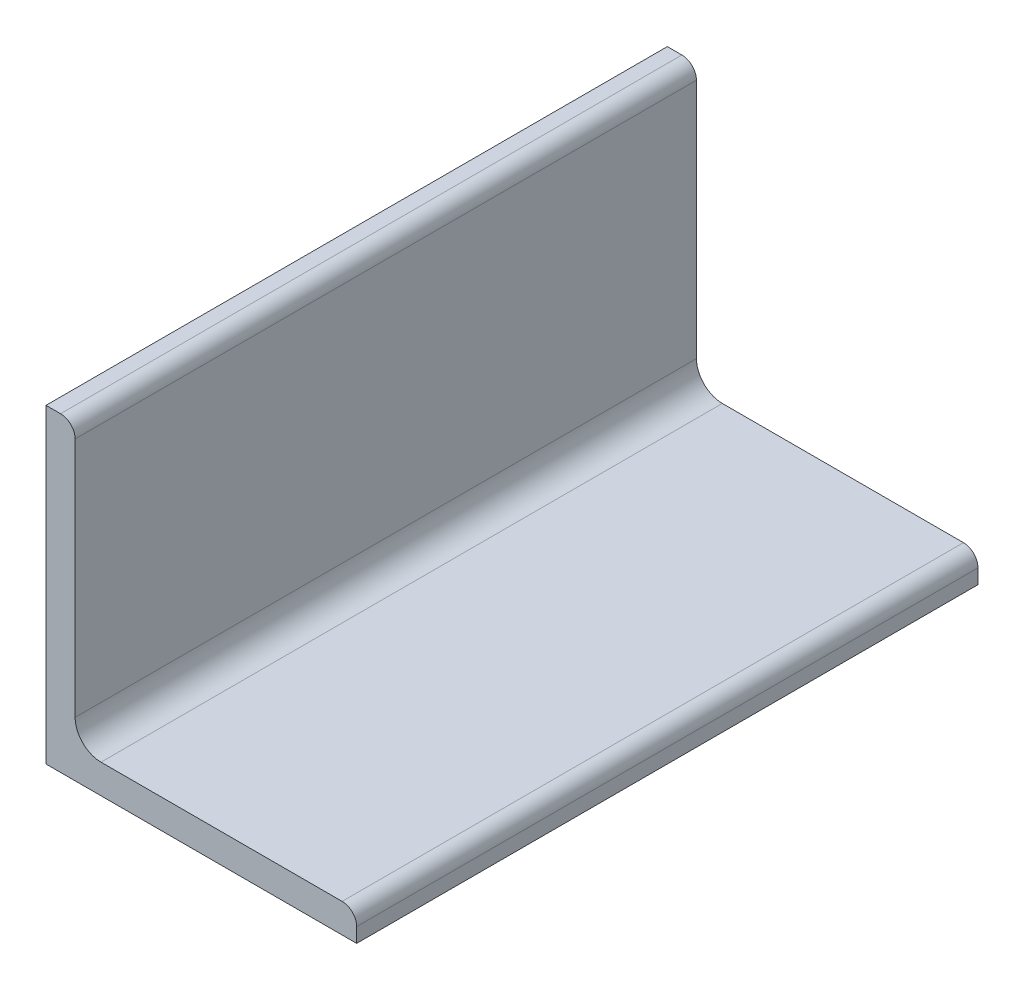
ISO-10303-21;
HEADER;
FILE_DESCRIPTION(('STEP AP214'),'2;1');
FILE_NAME('part.step','',(''),(''),'','','');
FILE_SCHEMA(('AUTOMOTIVE_DESIGN { 1 0 10303 214 1 1 1 1 }'));
ENDSEC;
DATA;
#1=APPLICATION_CONTEXT('core data for automotive mechanical design processes');
#2=APPLICATION_PROTOCOL_DEFINITION('international standard','automotive_design',2000,#1);
#3=PRODUCT_CONTEXT('',#1,'mechanical');
#4=PRODUCT('Part','Part','',(#3));
#5=PRODUCT_RELATED_PRODUCT_CATEGORY('part','',(#4));
#6=PRODUCT_DEFINITION_FORMATION('','',#4);
#7=PRODUCT_DEFINITION_CONTEXT('part definition',#1,'design');
#8=PRODUCT_DEFINITION('design','',#6,#7);
#9=PRODUCT_DEFINITION_SHAPE('','',#8);
#10=(LENGTH_UNIT() NAMED_UNIT(*) SI_UNIT(.MILLI.,.METRE.));
#11=(NAMED_UNIT(*) PLANE_ANGLE_UNIT() SI_UNIT($,.RADIAN.));
#12=(NAMED_UNIT(*) SI_UNIT($,.STERADIAN.) SOLID_ANGLE_UNIT());
#13=UNCERTAINTY_MEASURE_WITH_UNIT(LENGTH_MEASURE(1.E-05),#10,'distance_accuracy_value','');
#14=(GEOMETRIC_REPRESENTATION_CONTEXT(3) GLOBAL_UNCERTAINTY_ASSIGNED_CONTEXT((#13)) GLOBAL_UNIT_ASSIGNED_CONTEXT((#10,
#11,#12)) REPRESENTATION_CONTEXT('',''));
#15=CARTESIAN_POINT('',(0.,0.,0.));
#16=DIRECTION('',(0.,0.,1.));
#17=DIRECTION('',(1.,0.,0.));
#18=AXIS2_PLACEMENT_3D('',#15,#16,#17);
#19=CARTESIAN_POINT('',(0.425014111727251,152.925428131371,304.8));
#20=DIRECTION('',(1.,0.,0.));
#21=DIRECTION('',(0.,0.,-1.));
#22=AXIS2_PLACEMENT_3D('',#19,#20,#21);
#23=PLANE('',#22);
#24=DIRECTION('',(0.,-1.,0.));
#25=VECTOR('',#24,1.);
#26=CARTESIAN_POINT('',(0.425014111727251,152.925428131371,0.));
#27=LINE('',#26,#25);
#28=CARTESIAN_POINT('',(0.425014111727251,152.925428131371,0.));
#29=VERTEX_POINT('',#28);
#30=CARTESIAN_POINT('',(0.425014111727251,0.525428131371291,0.));
#31=VERTEX_POINT('',#30);
#32=EDGE_CURVE('E135',#29,#31,#27,.T.);
#33=ORIENTED_EDGE('',*,*,#32,.T.);
#34=DIRECTION('',(0.,0.,-1.));
#35=VECTOR('',#34,1.);
#36=CARTESIAN_POINT('',(0.425014111727251,0.525428131371291,304.8));
#37=LINE('',#36,#35);
#38=CARTESIAN_POINT('',(0.425014111727251,0.525428131371291,304.8));
#39=VERTEX_POINT('',#38);
#40=EDGE_CURVE('E11',#39,#31,#37,.T.);
#41=ORIENTED_EDGE('',*,*,#40,.F.);
#42=DIRECTION('',(0.,-1.,0.));
#43=VECTOR('',#42,1.);
#44=CARTESIAN_POINT('',(0.425014111727251,152.925428131371,304.8));
#45=LINE('',#44,#43);
#46=CARTESIAN_POINT('',(0.425014111727251,152.925428131371,304.8));
#47=VERTEX_POINT('',#46);
#48=EDGE_CURVE('E151',#47,#39,#45,.T.);
#49=ORIENTED_EDGE('',*,*,#48,.F.);
#50=DIRECTION('',(0.,0.,-1.));
#51=VECTOR('',#50,1.);
#52=CARTESIAN_POINT('',(0.425014111727251,152.925428131371,304.8));
#53=LINE('',#52,#51);
#54=EDGE_CURVE('E131',#47,#29,#53,.T.);
#55=ORIENTED_EDGE('',*,*,#54,.T.);
#56=EDGE_LOOP('',(#33,#41,#49,#55));
#57=FACE_BOUND('',#56,.T.);
#58=ADVANCED_FACE('F33',(#57),#23,.F.);
#59=CARTESIAN_POINT('',(0.425014111727251,0.525428131371291,304.8));
#60=DIRECTION('',(0.,1.,0.));
#61=DIRECTION('',(0.,0.,1.));
#62=AXIS2_PLACEMENT_3D('',#59,#60,#61);
#63=PLANE('',#62);
#64=DIRECTION('',(1.,0.,0.));
#65=VECTOR('',#64,1.);
#66=CARTESIAN_POINT('',(0.425014111727251,0.525428131371291,0.));
#67=LINE('',#66,#65);
#68=CARTESIAN_POINT('',(152.825014111727,0.525428131371291,0.));
#69=VERTEX_POINT('',#68);
#70=EDGE_CURVE('E138',#31,#69,#67,.T.);
#71=ORIENTED_EDGE('',*,*,#70,.T.);
#72=DIRECTION('',(0.,0.,-1.));
#73=VECTOR('',#72,1.);
#74=CARTESIAN_POINT('',(152.825014111727,0.525428131371291,304.8));
#75=LINE('',#74,#73);
#76=CARTESIAN_POINT('',(152.825014111727,0.525428131371291,304.8));
#77=VERTEX_POINT('',#76);
#78=EDGE_CURVE('E41',#77,#69,#75,.T.);
#79=ORIENTED_EDGE('',*,*,#78,.F.);
#80=DIRECTION('',(1.,0.,0.));
#81=VECTOR('',#80,1.);
#82=CARTESIAN_POINT('',(0.425014111727251,0.525428131371291,304.8));
#83=LINE('',#82,#81);
#84=EDGE_CURVE('E95',#39,#77,#83,.T.);
#85=ORIENTED_EDGE('',*,*,#84,.F.);
#86=ORIENTED_EDGE('',*,*,#40,.T.);
#87=EDGE_LOOP('',(#71,#79,#85,#86));
#88=FACE_BOUND('',#87,.T.);
#89=ADVANCED_FACE('F194',(#88),#63,.F.);
#90=CARTESIAN_POINT('',(152.825014111727,0.525428131371291,304.8));
#91=DIRECTION('',(-1.,0.,0.));
#92=DIRECTION('',(0.,0.,1.));
#93=AXIS2_PLACEMENT_3D('',#90,#91,#92);
#94=PLANE('',#93);
#95=DIRECTION('',(0.,1.,0.));
#96=VECTOR('',#95,1.);
#97=CARTESIAN_POINT('',(152.825014111727,0.525428131371291,0.));
#98=LINE('',#97,#96);
#99=CARTESIAN_POINT('',(152.825014111727,7.66917813137129,0.));
#100=VERTEX_POINT('',#99);
#101=EDGE_CURVE('E140',#69,#100,#98,.T.);
#102=ORIENTED_EDGE('',*,*,#101,.T.);
#103=DIRECTION('',(0.,0.,-1.));
#104=VECTOR('',#103,1.);
#105=CARTESIAN_POINT('',(152.825014111727,7.66917813137129,304.8));
#106=LINE('',#105,#104);
#107=CARTESIAN_POINT('',(152.825014111727,7.66917813137129,304.8));
#108=VERTEX_POINT('',#107);
#109=EDGE_CURVE('E161',#108,#100,#106,.T.);
#110=ORIENTED_EDGE('',*,*,#109,.F.);
#111=DIRECTION('',(0.,1.,0.));
#112=VECTOR('',#111,1.);
#113=CARTESIAN_POINT('',(152.825014111727,0.525428131371291,304.8));
#114=LINE('',#113,#112);
#115=EDGE_CURVE('E169',#77,#108,#114,.T.);
#116=ORIENTED_EDGE('',*,*,#115,.F.);
#117=ORIENTED_EDGE('',*,*,#78,.T.);
#118=EDGE_LOOP('',(#102,#110,#116,#117));
#119=FACE_BOUND('',#118,.T.);
#120=ADVANCED_FACE('F167',(#119),#94,.F.);
#121=CARTESIAN_POINT('',(145.681264111727,7.66917813137129,304.8));
#122=DIRECTION('',(0.,0.,-1.));
#123=DIRECTION('',(-1.,0.,0.));
#124=AXIS2_PLACEMENT_3D('',#121,#122,#123);
#125=CYLINDRICAL_SURFACE('',#124,7.14375);
#126=CARTESIAN_POINT('',(145.681264111727,7.66917813137129,0.));
#127=DIRECTION('',(0.,0.,1.));
#128=DIRECTION('',(1.,0.,0.));
#129=AXIS2_PLACEMENT_3D('',#126,#127,#128);
#130=CIRCLE('',#129,7.14375);
#131=CARTESIAN_POINT('',(145.681264111727,14.8129281313713,0.));
#132=VERTEX_POINT('',#131);
#133=EDGE_CURVE('E142',#100,#132,#130,.T.);
#134=ORIENTED_EDGE('',*,*,#133,.T.);
#135=DIRECTION('',(0.,0.,-1.));
#136=VECTOR('',#135,1.);
#137=CARTESIAN_POINT('',(145.681264111727,14.8129281313713,304.8));
#138=LINE('',#137,#136);
#139=CARTESIAN_POINT('',(145.681264111727,14.8129281313713,304.8));
#140=VERTEX_POINT('',#139);
#141=EDGE_CURVE('E158',#140,#132,#138,.T.);
#142=ORIENTED_EDGE('',*,*,#141,.F.);
#143=CARTESIAN_POINT('',(145.681264111727,7.66917813137129,304.8));
#144=DIRECTION('',(0.,0.,1.));
#145=DIRECTION('',(1.,0.,0.));
#146=AXIS2_PLACEMENT_3D('',#143,#144,#145);
#147=CIRCLE('',#146,7.14375);
#148=EDGE_CURVE('E185',#108,#140,#147,.T.);
#149=ORIENTED_EDGE('',*,*,#148,.F.);
#150=ORIENTED_EDGE('',*,*,#109,.T.);
#151=EDGE_LOOP('',(#134,#142,#149,#150));
#152=FACE_BOUND('',#151,.T.);
#153=ADVANCED_FACE('F178',(#152),#125,.T.);
#154=CARTESIAN_POINT('',(145.681264111727,14.8129281313713,304.8));
#155=DIRECTION('',(0.,-1.,0.));
#156=DIRECTION('',(0.,0.,-1.));
#157=AXIS2_PLACEMENT_3D('',#154,#155,#156);
#158=PLANE('',#157);
#159=DIRECTION('',(-1.,0.,0.));
#160=VECTOR('',#159,1.);
#161=CARTESIAN_POINT('',(145.681264111727,14.8129281313713,0.));
#162=LINE('',#161,#160);
#163=CARTESIAN_POINT('',(27.4125141117273,14.8129281313713,0.));
#164=VERTEX_POINT('',#163);
#165=EDGE_CURVE('E144',#132,#164,#162,.T.);
#166=ORIENTED_EDGE('',*,*,#165,.T.);
#167=DIRECTION('',(0.,0.,-1.));
#168=VECTOR('',#167,1.);
#169=CARTESIAN_POINT('',(27.4125141117273,14.8129281313713,304.8));
#170=LINE('',#169,#168);
#171=CARTESIAN_POINT('',(27.4125141117273,14.8129281313713,304.8));
#172=VERTEX_POINT('',#171);
#173=EDGE_CURVE('E155',#172,#164,#170,.T.);
#174=ORIENTED_EDGE('',*,*,#173,.F.);
#175=DIRECTION('',(-1.,0.,0.));
#176=VECTOR('',#175,1.);
#177=CARTESIAN_POINT('',(145.681264111727,14.8129281313713,304.8));
#178=LINE('',#177,#176);
#179=EDGE_CURVE('E184',#140,#172,#178,.T.);
#180=ORIENTED_EDGE('',*,*,#179,.F.);
#181=ORIENTED_EDGE('',*,*,#141,.T.);
#182=EDGE_LOOP('',(#166,#174,#180,#181));
#183=FACE_BOUND('',#182,.T.);
#184=ADVANCED_FACE('F182',(#183),#158,.F.);
#185=CARTESIAN_POINT('',(27.4125141117272,27.5129281313713,304.8));
#186=DIRECTION('',(0.,0.,-1.));
#187=DIRECTION('',(-1.,0.,0.));
#188=AXIS2_PLACEMENT_3D('',#185,#186,#187);
#189=CYLINDRICAL_SURFACE('',#188,12.7);
#190=CARTESIAN_POINT('',(27.4125141117272,27.5129281313713,0.));
#191=DIRECTION('',(0.,0.,-1.));
#192=DIRECTION('',(1.,0.,0.));
#193=AXIS2_PLACEMENT_3D('',#190,#191,#192);
#194=CIRCLE('',#193,12.7);
#195=CARTESIAN_POINT('',(14.7125141117273,27.5129281313713,0.));
#196=VERTEX_POINT('',#195);
#197=EDGE_CURVE('E146',#164,#196,#194,.T.);
#198=ORIENTED_EDGE('',*,*,#197,.T.);
#199=DIRECTION('',(0.,0.,-1.));
#200=VECTOR('',#199,1.);
#201=CARTESIAN_POINT('',(14.7125141117273,27.5129281313713,304.8));
#202=LINE('',#201,#200);
#203=CARTESIAN_POINT('',(14.7125141117273,27.5129281313713,304.8));
#204=VERTEX_POINT('',#203);
#205=EDGE_CURVE('E126',#204,#196,#202,.T.);
#206=ORIENTED_EDGE('',*,*,#205,.F.);
#207=CARTESIAN_POINT('',(27.4125141117272,27.5129281313713,304.8));
#208=DIRECTION('',(0.,0.,-1.));
#209=DIRECTION('',(1.,0.,0.));
#210=AXIS2_PLACEMENT_3D('',#207,#208,#209);
#211=CIRCLE('',#210,12.7);
#212=EDGE_CURVE('E117',#172,#204,#211,.T.);
#213=ORIENTED_EDGE('',*,*,#212,.F.);
#214=ORIENTED_EDGE('',*,*,#173,.T.);
#215=EDGE_LOOP('',(#198,#206,#213,#214));
#216=FACE_BOUND('',#215,.T.);
#217=ADVANCED_FACE('F206',(#216),#189,.F.);
#218=CARTESIAN_POINT('',(14.7125141117273,27.5129281313713,304.8));
#219=DIRECTION('',(-1.,0.,0.));
#220=DIRECTION('',(0.,0.,1.));
#221=AXIS2_PLACEMENT_3D('',#218,#219,#220);
#222=PLANE('',#221);
#223=DIRECTION('',(0.,1.,0.));
#224=VECTOR('',#223,1.);
#225=CARTESIAN_POINT('',(14.7125141117273,27.5129281313713,0.));
#226=LINE('',#225,#224);
#227=CARTESIAN_POINT('',(14.7125141117273,145.781678131371,0.));
#228=VERTEX_POINT('',#227);
#229=EDGE_CURVE('E125',#196,#228,#226,.T.);
#230=ORIENTED_EDGE('',*,*,#229,.T.);
#231=DIRECTION('',(0.,0.,-1.));
#232=VECTOR('',#231,1.);
#233=CARTESIAN_POINT('',(14.7125141117273,145.781678131371,304.8));
#234=LINE('',#233,#232);
#235=CARTESIAN_POINT('',(14.7125141117273,145.781678131371,304.8));
#236=VERTEX_POINT('',#235);
#237=EDGE_CURVE('E122',#236,#228,#234,.T.);
#238=ORIENTED_EDGE('',*,*,#237,.F.);
#239=DIRECTION('',(0.,1.,0.));
#240=VECTOR('',#239,1.);
#241=CARTESIAN_POINT('',(14.7125141117273,27.5129281313713,304.8));
#242=LINE('',#241,#240);
#243=EDGE_CURVE('E111',#204,#236,#242,.T.);
#244=ORIENTED_EDGE('',*,*,#243,.F.);
#245=ORIENTED_EDGE('',*,*,#205,.T.);
#246=EDGE_LOOP('',(#230,#238,#244,#245));
#247=FACE_BOUND('',#246,.T.);
#248=ADVANCED_FACE('F123',(#247),#222,.F.);
#249=CARTESIAN_POINT('',(7.56876411172725,145.781678131371,304.8));
#250=DIRECTION('',(0.,0.,-1.));
#251=DIRECTION('',(-1.,0.,0.));
#252=AXIS2_PLACEMENT_3D('',#249,#250,#251);
#253=CYLINDRICAL_SURFACE('',#252,7.14375);
#254=CARTESIAN_POINT('',(7.56876411172725,145.781678131371,0.));
#255=DIRECTION('',(0.,0.,1.));
#256=DIRECTION('',(1.,0.,0.));
#257=AXIS2_PLACEMENT_3D('',#254,#255,#256);
#258=CIRCLE('',#257,7.14375);
#259=CARTESIAN_POINT('',(7.56876411172725,152.925428131371,0.));
#260=VERTEX_POINT('',#259);
#261=EDGE_CURVE('E81',#228,#260,#258,.T.);
#262=ORIENTED_EDGE('',*,*,#261,.T.);
#263=DIRECTION('',(0.,0.,-1.));
#264=VECTOR('',#263,1.);
#265=CARTESIAN_POINT('',(7.56876411172725,152.925428131371,304.8));
#266=LINE('',#265,#264);
#267=CARTESIAN_POINT('',(7.56876411172725,152.925428131371,304.8));
#268=VERTEX_POINT('',#267);
#269=EDGE_CURVE('E127',#268,#260,#266,.T.);
#270=ORIENTED_EDGE('',*,*,#269,.F.);
#271=CARTESIAN_POINT('',(7.56876411172725,145.781678131371,304.8));
#272=DIRECTION('',(0.,0.,1.));
#273=DIRECTION('',(1.,0.,0.));
#274=AXIS2_PLACEMENT_3D('',#271,#272,#273);
#275=CIRCLE('',#274,7.14375);
#276=EDGE_CURVE('E115',#236,#268,#275,.T.);
#277=ORIENTED_EDGE('',*,*,#276,.F.);
#278=ORIENTED_EDGE('',*,*,#237,.T.);
#279=EDGE_LOOP('',(#262,#270,#277,#278));
#280=FACE_BOUND('',#279,.T.);
#281=ADVANCED_FACE('F129',(#280),#253,.T.);
#282=CARTESIAN_POINT('',(7.56876411172725,152.925428131371,304.8));
#283=DIRECTION('',(0.,-1.,0.));
#284=DIRECTION('',(0.,0.,-1.));
#285=AXIS2_PLACEMENT_3D('',#282,#283,#284);
#286=PLANE('',#285);
#287=DIRECTION('',(-1.,0.,0.));
#288=VECTOR('',#287,1.);
#289=CARTESIAN_POINT('',(7.56876411172725,152.925428131371,0.));
#290=LINE('',#289,#288);
#291=EDGE_CURVE('E87',#260,#29,#290,.T.);
#292=ORIENTED_EDGE('',*,*,#291,.T.);
#293=ORIENTED_EDGE('',*,*,#54,.F.);
#294=DIRECTION('',(-1.,0.,0.));
#295=VECTOR('',#294,1.);
#296=CARTESIAN_POINT('',(7.56876411172725,152.925428131371,304.8));
#297=LINE('',#296,#295);
#298=EDGE_CURVE('E49',#268,#47,#297,.T.);
#299=ORIENTED_EDGE('',*,*,#298,.F.);
#300=ORIENTED_EDGE('',*,*,#269,.T.);
#301=EDGE_LOOP('',(#292,#293,#299,#300));
#302=FACE_BOUND('',#301,.T.);
#303=ADVANCED_FACE('F214',(#302),#286,.F.);
#304=CARTESIAN_POINT('',(145.681264111727,7.66917813137129,304.8));
#305=DIRECTION('',(0.,0.,1.));
#306=DIRECTION('',(1.,0.,0.));
#307=AXIS2_PLACEMENT_3D('',#304,#305,#306);
#308=PLANE('',#307);
#309=ORIENTED_EDGE('',*,*,#48,.T.);
#310=ORIENTED_EDGE('',*,*,#84,.T.);
#311=ORIENTED_EDGE('',*,*,#115,.T.);
#312=ORIENTED_EDGE('',*,*,#148,.T.);
#313=ORIENTED_EDGE('',*,*,#179,.T.);
#314=ORIENTED_EDGE('',*,*,#212,.T.);
#315=ORIENTED_EDGE('',*,*,#243,.T.);
#316=ORIENTED_EDGE('',*,*,#276,.T.);
#317=ORIENTED_EDGE('',*,*,#298,.T.);
#318=EDGE_LOOP('',(#309,#310,#311,#312,#313,#314,#315,#316,#317));
#319=FACE_BOUND('',#318,.T.);
#320=ADVANCED_FACE('F113',(#319),#308,.T.);
#321=CARTESIAN_POINT('',(145.681264111727,7.66917813137129,0.));
#322=DIRECTION('',(0.,0.,1.));
#323=DIRECTION('',(1.,0.,0.));
#324=AXIS2_PLACEMENT_3D('',#321,#322,#323);
#325=PLANE('',#324);
#326=ORIENTED_EDGE('',*,*,#32,.F.);
#327=ORIENTED_EDGE('',*,*,#291,.F.);
#328=ORIENTED_EDGE('',*,*,#261,.F.);
#329=ORIENTED_EDGE('',*,*,#229,.F.);
#330=ORIENTED_EDGE('',*,*,#197,.F.);
#331=ORIENTED_EDGE('',*,*,#165,.F.);
#332=ORIENTED_EDGE('',*,*,#133,.F.);
#333=ORIENTED_EDGE('',*,*,#101,.F.);
#334=ORIENTED_EDGE('',*,*,#70,.F.);
#335=EDGE_LOOP('',(#326,#327,#328,#329,#330,#331,#332,#333,#334));
#336=FACE_BOUND('',#335,.T.);
#337=ADVANCED_FACE('F173',(#336),#325,.F.);
#338=CLOSED_SHELL('',(#58,#89,#120,#153,#184,#217,#248,#281,#303,#320,#337));
#339=MANIFOLD_SOLID_BREP('B2',#338);
#340=ADVANCED_BREP_SHAPE_REPRESENTATION('',(#18,#339),#14);
#341=SHAPE_DEFINITION_REPRESENTATION(#9,#340);
ENDSEC;
END-ISO-10303-21;
